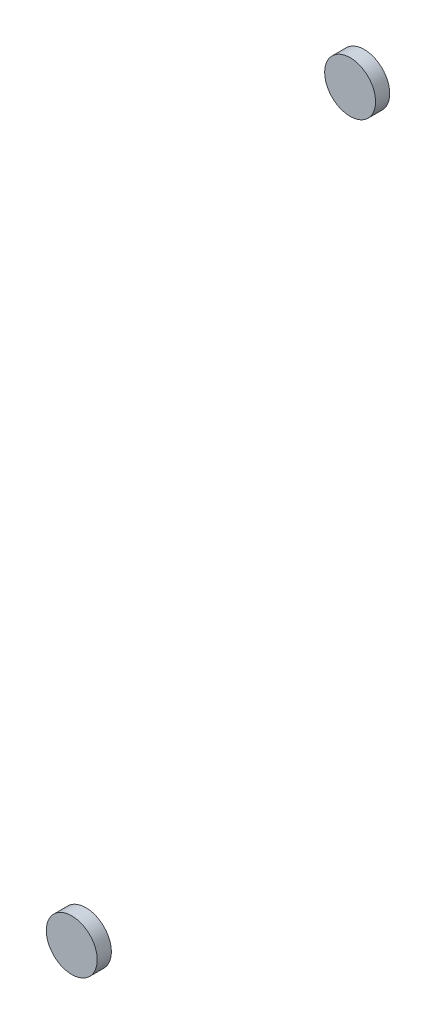
ISO-10303-21;
HEADER;
FILE_DESCRIPTION(('STEP AP214'),'2;1');
FILE_NAME('part.step','',(''),(''),'','','');
FILE_SCHEMA(('AUTOMOTIVE_DESIGN { 1 0 10303 214 1 1 1 1 }'));
ENDSEC;
DATA;
#1=APPLICATION_CONTEXT('core data for automotive mechanical design processes');
#2=APPLICATION_PROTOCOL_DEFINITION('international standard','automotive_design',2000,#1);
#3=PRODUCT_CONTEXT('',#1,'mechanical');
#4=PRODUCT('Part','Part','',(#3));
#5=PRODUCT_RELATED_PRODUCT_CATEGORY('part','',(#4));
#6=PRODUCT_DEFINITION_FORMATION('','',#4);
#7=PRODUCT_DEFINITION_CONTEXT('part definition',#1,'design');
#8=PRODUCT_DEFINITION('design','',#6,#7);
#9=PRODUCT_DEFINITION_SHAPE('','',#8);
#10=(LENGTH_UNIT() NAMED_UNIT(*) SI_UNIT(.MILLI.,.METRE.));
#11=(NAMED_UNIT(*) PLANE_ANGLE_UNIT() SI_UNIT($,.RADIAN.));
#12=(NAMED_UNIT(*) SI_UNIT($,.STERADIAN.) SOLID_ANGLE_UNIT());
#13=UNCERTAINTY_MEASURE_WITH_UNIT(LENGTH_MEASURE(1.E-05),#10,'distance_accuracy_value','');
#14=(GEOMETRIC_REPRESENTATION_CONTEXT(3) GLOBAL_UNCERTAINTY_ASSIGNED_CONTEXT((#13)) GLOBAL_UNIT_ASSIGNED_CONTEXT((#10,
#11,#12)) REPRESENTATION_CONTEXT('',''));
#15=CARTESIAN_POINT('',(0.,0.,0.));
#16=DIRECTION('',(0.,0.,1.));
#17=DIRECTION('',(1.,0.,0.));
#18=AXIS2_PLACEMENT_3D('',#15,#16,#17);
#19=CARTESIAN_POINT('',(-11.2350024412425,4.03096775475198,-0.253998963258981));
#20=DIRECTION('',(0.,-8.74227339409092E-08,1.));
#21=DIRECTION('',(1.,-8.74227765734792E-08,0.));
#22=AXIS2_PLACEMENT_3D('',#19,#20,#21);
#23=PLANE('',#22);
#24=CARTESIAN_POINT('',(-10.7778024412425,4.03096771478228,-0.253998963258985));
#25=DIRECTION('',(0.,8.74227339409092E-08,-1.));
#26=DIRECTION('',(-1.,8.74227765734792E-08,0.));
#27=AXIS2_PLACEMENT_3D('',#24,#25,#26);
#28=CIRCLE('',#27,0.4572);
#29=CARTESIAN_POINT('',(-11.2350024412425,4.03096775475198,-0.253998963258982));
#30=VERTEX_POINT('',#29);
#31=EDGE_CURVE('P0_E10',#30,#30,#28,.T.);
#32=ORIENTED_EDGE('',*,*,#31,.T.);
#33=EDGE_LOOP('',(#32));
#34=FACE_BOUND('',#33,.T.);
#35=ADVANCED_FACE('P0_F15',(#34),#23,.F.);
#36=CARTESIAN_POINT('',(-11.2350024412425,4.03096773254661,1.0367410172539E-06));
#37=DIRECTION('',(0.,-8.74227339409092E-08,1.));
#38=DIRECTION('',(1.,-8.74227765734792E-08,0.));
#39=AXIS2_PLACEMENT_3D('',#36,#37,#38);
#40=PLANE('',#39);
#41=CARTESIAN_POINT('',(-10.7778024412425,4.03096769257691,1.03674101378445E-06));
#42=DIRECTION('',(0.,8.74227339409092E-08,-1.));
#43=DIRECTION('',(-1.,8.74227765734792E-08,0.));
#44=AXIS2_PLACEMENT_3D('',#41,#42,#43);
#45=CIRCLE('',#44,0.4572);
#46=CARTESIAN_POINT('',(-11.2350024412425,4.0309677325466,1.03674101727871E-06));
#47=VERTEX_POINT('',#46);
#48=EDGE_CURVE('P0_E22',#47,#47,#45,.T.);
#49=ORIENTED_EDGE('',*,*,#48,.F.);
#50=EDGE_LOOP('',(#49));
#51=FACE_BOUND('',#50,.T.);
#52=ADVANCED_FACE('P0_F35',(#51),#40,.T.);
#53=CARTESIAN_POINT('',(-10.7778024412425,4.03096769257691,1.03674101378445E-06));
#54=DIRECTION('',(0.,-8.74227339409092E-08,1.));
#55=DIRECTION('',(-1.,8.74227765734792E-08,0.));
#56=AXIS2_PLACEMENT_3D('',#53,#54,#55);
#57=CYLINDRICAL_SURFACE('',#56,0.4572);
#58=ORIENTED_EDGE('',*,*,#31,.F.);
#59=EDGE_LOOP('',(#58));
#60=FACE_BOUND('',#59,.T.);
#61=ORIENTED_EDGE('',*,*,#48,.T.);
#62=EDGE_LOOP('',(#61));
#63=FACE_BOUND('',#62,.T.);
#64=ADVANCED_FACE('P0_F33',(#60,#63),#57,.T.);
#65=CLOSED_SHELL('',(#35,#52,#64));
#66=MANIFOLD_SOLID_BREP('P0_B1',#65);
#67=CARTESIAN_POINT('',(-5.77780243579021,20.3381738182925,-0.253998923289316));
#68=DIRECTION('',(0.,-8.74227339409095E-08,1.));
#69=DIRECTION('',(-1.19248806384999E-08,-1.,-8.74227339409095E-08));
#70=AXIS2_PLACEMENT_3D('',#67,#68,#69);
#71=PLANE('',#70);
#72=CARTESIAN_POINT('',(-5.77780244124226,19.8809738182926,-0.253998963258991));
#73=DIRECTION('',(0.,8.74227339409095E-08,-1.));
#74=DIRECTION('',(1.19248806384999E-08,1.,8.74227339409095E-08));
#75=AXIS2_PLACEMENT_3D('',#72,#73,#74);
#76=CIRCLE('',#75,0.4572);
#77=CARTESIAN_POINT('',(-5.7778024357902,20.3381738182926,-0.253998923289317));
#78=VERTEX_POINT('',#77);
#79=EDGE_CURVE('P1_E10',#78,#78,#76,.T.);
#80=ORIENTED_EDGE('',*,*,#79,.T.);
#81=EDGE_LOOP('',(#80));
#82=FACE_BOUND('',#81,.T.);
#83=ADVANCED_FACE('P1_F15',(#82),#71,.F.);
#84=CARTESIAN_POINT('',(-5.77780243579021,20.3381737960872,1.07671068285201E-06));
#85=DIRECTION('',(0.,-8.74227339409095E-08,1.));
#86=DIRECTION('',(-1.19248806384999E-08,-1.,-8.74227339409095E-08));
#87=AXIS2_PLACEMENT_3D('',#84,#85,#86);
#88=PLANE('',#87);
#89=CARTESIAN_POINT('',(-5.77780244124226,19.8809737960872,1.03674100901396E-06));
#90=DIRECTION('',(0.,8.74227339409095E-08,-1.));
#91=DIRECTION('',(1.19248806384999E-08,1.,8.74227339409095E-08));
#92=AXIS2_PLACEMENT_3D('',#89,#90,#91);
#93=CIRCLE('',#92,0.4572);
#94=CARTESIAN_POINT('',(-5.7778024357902,20.3381737960872,1.07671068297175E-06));
#95=VERTEX_POINT('',#94);
#96=EDGE_CURVE('P1_E22',#95,#95,#93,.T.);
#97=ORIENTED_EDGE('',*,*,#96,.F.);
#98=EDGE_LOOP('',(#97));
#99=FACE_BOUND('',#98,.T.);
#100=ADVANCED_FACE('P1_F35',(#99),#88,.T.);
#101=CARTESIAN_POINT('',(-5.77780244124226,19.8809737960872,1.03674100901396E-06));
#102=DIRECTION('',(0.,-8.74227339409095E-08,1.));
#103=DIRECTION('',(1.19248806384999E-08,1.,8.74227339409095E-08));
#104=AXIS2_PLACEMENT_3D('',#101,#102,#103);
#105=CYLINDRICAL_SURFACE('',#104,0.4572);
#106=ORIENTED_EDGE('',*,*,#79,.F.);
#107=EDGE_LOOP('',(#106));
#108=FACE_BOUND('',#107,.T.);
#109=ORIENTED_EDGE('',*,*,#96,.T.);
#110=EDGE_LOOP('',(#109));
#111=FACE_BOUND('',#110,.T.);
#112=ADVANCED_FACE('P1_F33',(#108,#111),#105,.T.);
#113=CLOSED_SHELL('',(#83,#100,#112));
#114=MANIFOLD_SOLID_BREP('P1_B1',#113);
#115=ADVANCED_BREP_SHAPE_REPRESENTATION('',(#18,#66,#114),#14);
#116=SHAPE_DEFINITION_REPRESENTATION(#9,#115);
ENDSEC;
END-ISO-10303-21;
